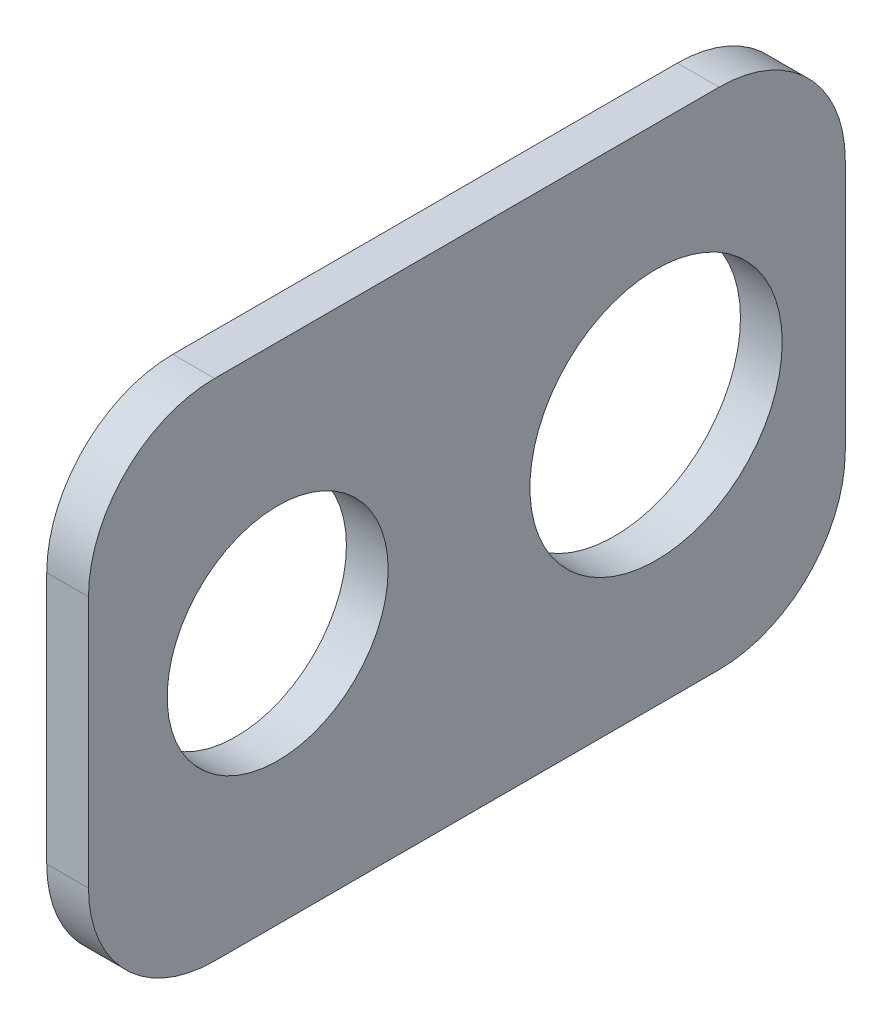
ISO-10303-21;
HEADER;
FILE_DESCRIPTION(('STEP AP214'),'2;1');
FILE_NAME('part.step','',(''),(''),'','','');
FILE_SCHEMA(('AUTOMOTIVE_DESIGN { 1 0 10303 214 1 1 1 1 }'));
ENDSEC;
DATA;
#1=APPLICATION_CONTEXT('core data for automotive mechanical design processes');
#2=APPLICATION_PROTOCOL_DEFINITION('international standard','automotive_design',2000,#1);
#3=PRODUCT_CONTEXT('',#1,'mechanical');
#4=PRODUCT('Part','Part','',(#3));
#5=PRODUCT_RELATED_PRODUCT_CATEGORY('part','',(#4));
#6=PRODUCT_DEFINITION_FORMATION('','',#4);
#7=PRODUCT_DEFINITION_CONTEXT('part definition',#1,'design');
#8=PRODUCT_DEFINITION('design','',#6,#7);
#9=PRODUCT_DEFINITION_SHAPE('','',#8);
#10=(LENGTH_UNIT() NAMED_UNIT(*) SI_UNIT(.MILLI.,.METRE.));
#11=(NAMED_UNIT(*) PLANE_ANGLE_UNIT() SI_UNIT($,.RADIAN.));
#12=(NAMED_UNIT(*) SI_UNIT($,.STERADIAN.) SOLID_ANGLE_UNIT());
#13=UNCERTAINTY_MEASURE_WITH_UNIT(LENGTH_MEASURE(1.E-05),#10,'distance_accuracy_value','');
#14=(GEOMETRIC_REPRESENTATION_CONTEXT(3) GLOBAL_UNCERTAINTY_ASSIGNED_CONTEXT((#13)) GLOBAL_UNIT_ASSIGNED_CONTEXT((#10,
#11,#12)) REPRESENTATION_CONTEXT('',''));
#15=CARTESIAN_POINT('',(0.,0.,0.));
#16=DIRECTION('',(0.,0.,1.));
#17=DIRECTION('',(1.,0.,0.));
#18=AXIS2_PLACEMENT_3D('',#15,#16,#17);
#19=CARTESIAN_POINT('',(4.20304803719862,0.,0.));
#20=DIRECTION('',(0.,0.,1.));
#21=DIRECTION('',(1.,0.,0.));
#22=AXIS2_PLACEMENT_3D('',#19,#20,#21);
#23=PLANE('',#22);
#24=DIRECTION('',(0.,1.,0.));
#25=VECTOR('',#24,1.);
#26=CARTESIAN_POINT('',(4.20304803719862,0.,0.));
#27=LINE('',#26,#25);
#28=CARTESIAN_POINT('',(4.20304803719862,12.7,0.));
#29=VERTEX_POINT('',#28);
#30=CARTESIAN_POINT('',(4.20304803719862,38.1,0.));
#31=VERTEX_POINT('',#30);
#32=EDGE_CURVE('E133',#29,#31,#27,.T.);
#33=ORIENTED_EDGE('',*,*,#32,.F.);
#34=DIRECTION('',(-1.,0.,0.));
#35=VECTOR('',#34,1.);
#36=CARTESIAN_POINT('',(0.,12.7,0.));
#37=LINE('',#36,#35);
#38=CARTESIAN_POINT('',(0.,12.7,0.));
#39=VERTEX_POINT('',#38);
#40=EDGE_CURVE('E119',#29,#39,#37,.T.);
#41=ORIENTED_EDGE('',*,*,#40,.T.);
#42=DIRECTION('',(0.,1.,0.));
#43=VECTOR('',#42,1.);
#44=CARTESIAN_POINT('',(0.,0.,0.));
#45=LINE('',#44,#43);
#46=CARTESIAN_POINT('',(0.,38.1,0.));
#47=VERTEX_POINT('',#46);
#48=EDGE_CURVE('E131',#39,#47,#45,.T.);
#49=ORIENTED_EDGE('',*,*,#48,.T.);
#50=DIRECTION('',(-1.,0.,0.));
#51=VECTOR('',#50,1.);
#52=CARTESIAN_POINT('',(4.20304803719862,38.1,0.));
#53=LINE('',#52,#51);
#54=EDGE_CURVE('E139',#47,#31,#53,.F.);
#55=ORIENTED_EDGE('',*,*,#54,.T.);
#56=EDGE_LOOP('',(#33,#41,#49,#55));
#57=FACE_BOUND('',#56,.T.);
#58=ADVANCED_FACE('F50',(#57),#23,.F.);
#59=CARTESIAN_POINT('',(4.20304803719862,50.8,0.));
#60=DIRECTION('',(0.,-1.,0.));
#61=DIRECTION('',(0.,0.,-1.));
#62=AXIS2_PLACEMENT_3D('',#59,#60,#61);
#63=PLANE('',#62);
#64=DIRECTION('',(0.,0.,1.));
#65=VECTOR('',#64,1.);
#66=CARTESIAN_POINT('',(4.20304803719862,50.8,0.));
#67=LINE('',#66,#65);
#68=CARTESIAN_POINT('',(4.20304803719862,50.8,12.7));
#69=VERTEX_POINT('',#68);
#70=CARTESIAN_POINT('',(4.20304803719862,50.8,63.5));
#71=VERTEX_POINT('',#70);
#72=EDGE_CURVE('E199',#69,#71,#67,.T.);
#73=ORIENTED_EDGE('',*,*,#72,.F.);
#74=DIRECTION('',(-1.,0.,0.));
#75=VECTOR('',#74,1.);
#76=CARTESIAN_POINT('',(4.20304803719862,50.8,12.7));
#77=LINE('',#76,#75);
#78=CARTESIAN_POINT('',(0.,50.8,12.7));
#79=VERTEX_POINT('',#78);
#80=EDGE_CURVE('E193',#69,#79,#77,.T.);
#81=ORIENTED_EDGE('',*,*,#80,.T.);
#82=DIRECTION('',(0.,0.,1.));
#83=VECTOR('',#82,1.);
#84=CARTESIAN_POINT('',(0.,50.8,0.));
#85=LINE('',#84,#83);
#86=CARTESIAN_POINT('',(0.,50.8,63.5));
#87=VERTEX_POINT('',#86);
#88=EDGE_CURVE('E142',#79,#87,#85,.T.);
#89=ORIENTED_EDGE('',*,*,#88,.T.);
#90=DIRECTION('',(-1.,0.,0.));
#91=VECTOR('',#90,1.);
#92=CARTESIAN_POINT('',(4.20304803719862,50.8,63.5));
#93=LINE('',#92,#91);
#94=EDGE_CURVE('E189',#87,#71,#93,.F.);
#95=ORIENTED_EDGE('',*,*,#94,.T.);
#96=EDGE_LOOP('',(#73,#81,#89,#95));
#97=FACE_BOUND('',#96,.T.);
#98=ADVANCED_FACE('F236',(#97),#63,.F.);
#99=CARTESIAN_POINT('',(4.20304803719862,0.,76.2));
#100=DIRECTION('',(0.,0.,1.));
#101=DIRECTION('',(1.,0.,0.));
#102=AXIS2_PLACEMENT_3D('',#99,#100,#101);
#103=PLANE('',#102);
#104=DIRECTION('',(0.,1.,0.));
#105=VECTOR('',#104,1.);
#106=CARTESIAN_POINT('',(4.20304803719862,0.,76.2));
#107=LINE('',#106,#105);
#108=CARTESIAN_POINT('',(4.20304803719862,12.7,76.2));
#109=VERTEX_POINT('',#108);
#110=CARTESIAN_POINT('',(4.20304803719862,38.1,76.2));
#111=VERTEX_POINT('',#110);
#112=EDGE_CURVE('E196',#109,#111,#107,.T.);
#113=ORIENTED_EDGE('',*,*,#112,.T.);
#114=DIRECTION('',(-1.,0.,0.));
#115=VECTOR('',#114,1.);
#116=CARTESIAN_POINT('',(0.,38.1,76.2));
#117=LINE('',#116,#115);
#118=CARTESIAN_POINT('',(0.,38.1,76.2));
#119=VERTEX_POINT('',#118);
#120=EDGE_CURVE('E11',#111,#119,#117,.T.);
#121=ORIENTED_EDGE('',*,*,#120,.T.);
#122=DIRECTION('',(0.,1.,0.));
#123=VECTOR('',#122,1.);
#124=CARTESIAN_POINT('',(0.,0.,76.2));
#125=LINE('',#124,#123);
#126=CARTESIAN_POINT('',(0.,12.7,76.2));
#127=VERTEX_POINT('',#126);
#128=EDGE_CURVE('E146',#127,#119,#125,.T.);
#129=ORIENTED_EDGE('',*,*,#128,.F.);
#130=DIRECTION('',(-1.,0.,0.));
#131=VECTOR('',#130,1.);
#132=CARTESIAN_POINT('',(4.20304803719862,12.7,76.2));
#133=LINE('',#132,#131);
#134=EDGE_CURVE('E57',#127,#109,#133,.F.);
#135=ORIENTED_EDGE('',*,*,#134,.T.);
#136=EDGE_LOOP('',(#113,#121,#129,#135));
#137=FACE_BOUND('',#136,.T.);
#138=ADVANCED_FACE('F233',(#137),#103,.T.);
#139=CARTESIAN_POINT('',(4.20304803719862,0.,0.));
#140=DIRECTION('',(0.,-1.,0.));
#141=DIRECTION('',(0.,0.,-1.));
#142=AXIS2_PLACEMENT_3D('',#139,#140,#141);
#143=PLANE('',#142);
#144=DIRECTION('',(0.,0.,1.));
#145=VECTOR('',#144,1.);
#146=CARTESIAN_POINT('',(0.,0.,0.));
#147=LINE('',#146,#145);
#148=CARTESIAN_POINT('',(0.,0.,12.7));
#149=VERTEX_POINT('',#148);
#150=CARTESIAN_POINT('',(0.,0.,63.5));
#151=VERTEX_POINT('',#150);
#152=EDGE_CURVE('E159',#149,#151,#147,.T.);
#153=ORIENTED_EDGE('',*,*,#152,.F.);
#154=DIRECTION('',(-1.,0.,0.));
#155=VECTOR('',#154,1.);
#156=CARTESIAN_POINT('',(4.20304803719862,0.,12.7));
#157=LINE('',#156,#155);
#158=CARTESIAN_POINT('',(4.20304803719862,0.,12.7));
#159=VERTEX_POINT('',#158);
#160=EDGE_CURVE('E118',#149,#159,#157,.F.);
#161=ORIENTED_EDGE('',*,*,#160,.T.);
#162=DIRECTION('',(0.,0.,1.));
#163=VECTOR('',#162,1.);
#164=CARTESIAN_POINT('',(4.20304803719862,0.,0.));
#165=LINE('',#164,#163);
#166=CARTESIAN_POINT('',(4.20304803719862,0.,63.5));
#167=VERTEX_POINT('',#166);
#168=EDGE_CURVE('E152',#159,#167,#165,.T.);
#169=ORIENTED_EDGE('',*,*,#168,.T.);
#170=DIRECTION('',(-1.,0.,0.));
#171=VECTOR('',#170,1.);
#172=CARTESIAN_POINT('',(4.20304803719862,0.,63.5));
#173=LINE('',#172,#171);
#174=EDGE_CURVE('E121',#167,#151,#173,.T.);
#175=ORIENTED_EDGE('',*,*,#174,.T.);
#176=EDGE_LOOP('',(#153,#161,#169,#175));
#177=FACE_BOUND('',#176,.T.);
#178=ADVANCED_FACE('F224',(#177),#143,.T.);
#179=CARTESIAN_POINT('',(4.20304803719862,0.,0.));
#180=DIRECTION('',(1.,0.,0.));
#181=DIRECTION('',(0.,0.,-1.));
#182=AXIS2_PLACEMENT_3D('',#179,#180,#181);
#183=PLANE('',#182);
#184=CARTESIAN_POINT('',(4.20304803719862,25.4,57.15));
#185=DIRECTION('',(1.,0.,0.));
#186=DIRECTION('',(0.,0.,-1.));
#187=AXIS2_PLACEMENT_3D('',#184,#185,#186);
#188=CIRCLE('',#187,11.1252);
#189=CARTESIAN_POINT('',(4.20304803719862,25.4,46.0248));
#190=VERTEX_POINT('',#189);
#191=EDGE_CURVE('E151',#190,#190,#188,.T.);
#192=ORIENTED_EDGE('',*,*,#191,.F.);
#193=EDGE_LOOP('',(#192));
#194=FACE_BOUND('',#193,.T.);
#195=CARTESIAN_POINT('',(4.20304803719862,25.4,19.05));
#196=DIRECTION('',(1.,0.,0.));
#197=DIRECTION('',(0.,0.,-1.));
#198=AXIS2_PLACEMENT_3D('',#195,#196,#197);
#199=CIRCLE('',#198,12.7);
#200=CARTESIAN_POINT('',(4.20304803719862,25.4,6.35));
#201=VERTEX_POINT('',#200);
#202=EDGE_CURVE('E209',#201,#201,#199,.T.);
#203=ORIENTED_EDGE('',*,*,#202,.F.);
#204=EDGE_LOOP('',(#203));
#205=FACE_BOUND('',#204,.T.);
#206=ORIENTED_EDGE('',*,*,#168,.F.);
#207=CARTESIAN_POINT('',(4.20304803719862,12.7,12.7));
#208=DIRECTION('',(1.,0.,0.));
#209=DIRECTION('',(0.,0.,-1.));
#210=AXIS2_PLACEMENT_3D('',#207,#208,#209);
#211=CIRCLE('',#210,12.7);
#212=EDGE_CURVE('E183',#159,#29,#211,.T.);
#213=ORIENTED_EDGE('',*,*,#212,.T.);
#214=ORIENTED_EDGE('',*,*,#32,.T.);
#215=CARTESIAN_POINT('',(4.20304803719862,38.1,12.7));
#216=DIRECTION('',(1.,0.,0.));
#217=DIRECTION('',(0.,0.,-1.));
#218=AXIS2_PLACEMENT_3D('',#215,#216,#217);
#219=CIRCLE('',#218,12.7);
#220=EDGE_CURVE('E185',#31,#69,#219,.T.);
#221=ORIENTED_EDGE('',*,*,#220,.T.);
#222=ORIENTED_EDGE('',*,*,#72,.T.);
#223=CARTESIAN_POINT('',(4.20304803719862,38.1,63.5));
#224=DIRECTION('',(1.,0.,0.));
#225=DIRECTION('',(0.,0.,-1.));
#226=AXIS2_PLACEMENT_3D('',#223,#224,#225);
#227=CIRCLE('',#226,12.7);
#228=EDGE_CURVE('E64',#71,#111,#227,.T.);
#229=ORIENTED_EDGE('',*,*,#228,.T.);
#230=ORIENTED_EDGE('',*,*,#112,.F.);
#231=CARTESIAN_POINT('',(4.20304803719862,12.7,63.5));
#232=DIRECTION('',(1.,0.,0.));
#233=DIRECTION('',(0.,0.,-1.));
#234=AXIS2_PLACEMENT_3D('',#231,#232,#233);
#235=CIRCLE('',#234,12.7);
#236=EDGE_CURVE('E179',#109,#167,#235,.T.);
#237=ORIENTED_EDGE('',*,*,#236,.T.);
#238=EDGE_LOOP('',(#206,#213,#214,#221,#222,#229,#230,#237));
#239=FACE_BOUND('',#238,.T.);
#240=ADVANCED_FACE('F219',(#194,#205,#239),#183,.T.);
#241=CARTESIAN_POINT('',(0.,0.,0.));
#242=DIRECTION('',(1.,0.,0.));
#243=DIRECTION('',(0.,0.,-1.));
#244=AXIS2_PLACEMENT_3D('',#241,#242,#243);
#245=PLANE('',#244);
#246=CARTESIAN_POINT('',(0.,25.4,57.15));
#247=DIRECTION('',(1.,0.,0.));
#248=DIRECTION('',(0.,0.,-1.));
#249=AXIS2_PLACEMENT_3D('',#246,#247,#248);
#250=CIRCLE('',#249,11.1252);
#251=CARTESIAN_POINT('',(0.,25.4,46.0248));
#252=VERTEX_POINT('',#251);
#253=EDGE_CURVE('E141',#252,#252,#250,.T.);
#254=ORIENTED_EDGE('',*,*,#253,.T.);
#255=EDGE_LOOP('',(#254));
#256=FACE_BOUND('',#255,.T.);
#257=CARTESIAN_POINT('',(0.,25.4,19.05));
#258=DIRECTION('',(1.,0.,0.));
#259=DIRECTION('',(0.,0.,-1.));
#260=AXIS2_PLACEMENT_3D('',#257,#258,#259);
#261=CIRCLE('',#260,12.7);
#262=CARTESIAN_POINT('',(0.,25.4,6.35));
#263=VERTEX_POINT('',#262);
#264=EDGE_CURVE('E206',#263,#263,#261,.T.);
#265=ORIENTED_EDGE('',*,*,#264,.T.);
#266=EDGE_LOOP('',(#265));
#267=FACE_BOUND('',#266,.T.);
#268=ORIENTED_EDGE('',*,*,#48,.F.);
#269=CARTESIAN_POINT('',(0.,12.7,12.7));
#270=DIRECTION('',(1.,0.,0.));
#271=DIRECTION('',(0.,0.,-1.));
#272=AXIS2_PLACEMENT_3D('',#269,#270,#271);
#273=CIRCLE('',#272,12.7);
#274=EDGE_CURVE('E111',#39,#149,#273,.F.);
#275=ORIENTED_EDGE('',*,*,#274,.T.);
#276=ORIENTED_EDGE('',*,*,#152,.T.);
#277=CARTESIAN_POINT('',(0.,12.7,63.5));
#278=DIRECTION('',(1.,0.,0.));
#279=DIRECTION('',(0.,0.,-1.));
#280=AXIS2_PLACEMENT_3D('',#277,#278,#279);
#281=CIRCLE('',#280,12.7);
#282=EDGE_CURVE('E138',#151,#127,#281,.F.);
#283=ORIENTED_EDGE('',*,*,#282,.T.);
#284=ORIENTED_EDGE('',*,*,#128,.T.);
#285=CARTESIAN_POINT('',(0.,38.1,63.5));
#286=DIRECTION('',(1.,0.,0.));
#287=DIRECTION('',(0.,0.,-1.));
#288=AXIS2_PLACEMENT_3D('',#285,#286,#287);
#289=CIRCLE('',#288,12.7);
#290=EDGE_CURVE('E170',#119,#87,#289,.F.);
#291=ORIENTED_EDGE('',*,*,#290,.T.);
#292=ORIENTED_EDGE('',*,*,#88,.F.);
#293=CARTESIAN_POINT('',(0.,38.1,12.7));
#294=DIRECTION('',(1.,0.,0.));
#295=DIRECTION('',(0.,0.,-1.));
#296=AXIS2_PLACEMENT_3D('',#293,#294,#295);
#297=CIRCLE('',#296,12.7);
#298=EDGE_CURVE('E127',#79,#47,#297,.F.);
#299=ORIENTED_EDGE('',*,*,#298,.T.);
#300=EDGE_LOOP('',(#268,#275,#276,#283,#284,#291,#292,#299));
#301=FACE_BOUND('',#300,.T.);
#302=ADVANCED_FACE('F140',(#256,#267,#301),#245,.F.);
#303=CARTESIAN_POINT('',(0.,25.4,19.05));
#304=DIRECTION('',(1.,0.,0.));
#305=DIRECTION('',(0.,0.,-1.));
#306=AXIS2_PLACEMENT_3D('',#303,#304,#305);
#307=CYLINDRICAL_SURFACE('',#306,12.7);
#308=ORIENTED_EDGE('',*,*,#264,.F.);
#309=EDGE_LOOP('',(#308));
#310=FACE_BOUND('',#309,.T.);
#311=ORIENTED_EDGE('',*,*,#202,.T.);
#312=EDGE_LOOP('',(#311));
#313=FACE_BOUND('',#312,.T.);
#314=ADVANCED_FACE('F265',(#310,#313),#307,.F.);
#315=CARTESIAN_POINT('',(0.,25.4,57.15));
#316=DIRECTION('',(1.,0.,0.));
#317=DIRECTION('',(0.,0.,-1.));
#318=AXIS2_PLACEMENT_3D('',#315,#316,#317);
#319=CYLINDRICAL_SURFACE('',#318,11.1252);
#320=ORIENTED_EDGE('',*,*,#253,.F.);
#321=EDGE_LOOP('',(#320));
#322=FACE_BOUND('',#321,.T.);
#323=ORIENTED_EDGE('',*,*,#191,.T.);
#324=EDGE_LOOP('',(#323));
#325=FACE_BOUND('',#324,.T.);
#326=ADVANCED_FACE('F217',(#322,#325),#319,.F.);
#327=CARTESIAN_POINT('',(4.20304803719862,12.7,12.7));
#328=DIRECTION('',(1.,0.,0.));
#329=DIRECTION('',(0.,0.,-1.));
#330=AXIS2_PLACEMENT_3D('',#327,#328,#329);
#331=CYLINDRICAL_SURFACE('',#330,12.7);
#332=ORIENTED_EDGE('',*,*,#212,.F.);
#333=ORIENTED_EDGE('',*,*,#160,.F.);
#334=ORIENTED_EDGE('',*,*,#274,.F.);
#335=ORIENTED_EDGE('',*,*,#40,.F.);
#336=EDGE_LOOP('',(#332,#333,#334,#335));
#337=FACE_BOUND('',#336,.T.);
#338=ADVANCED_FACE('F117',(#337),#331,.T.);
#339=CARTESIAN_POINT('',(4.20304803719862,38.1,12.7));
#340=DIRECTION('',(-1.,0.,0.));
#341=DIRECTION('',(0.,0.,1.));
#342=AXIS2_PLACEMENT_3D('',#339,#340,#341);
#343=CYLINDRICAL_SURFACE('',#342,12.7);
#344=ORIENTED_EDGE('',*,*,#220,.F.);
#345=ORIENTED_EDGE('',*,*,#54,.F.);
#346=ORIENTED_EDGE('',*,*,#298,.F.);
#347=ORIENTED_EDGE('',*,*,#80,.F.);
#348=EDGE_LOOP('',(#344,#345,#346,#347));
#349=FACE_BOUND('',#348,.T.);
#350=ADVANCED_FACE('F241',(#349),#343,.T.);
#351=CARTESIAN_POINT('',(4.20304803719862,38.1,63.5));
#352=DIRECTION('',(1.,0.,0.));
#353=DIRECTION('',(0.,0.,-1.));
#354=AXIS2_PLACEMENT_3D('',#351,#352,#353);
#355=CYLINDRICAL_SURFACE('',#354,12.7);
#356=ORIENTED_EDGE('',*,*,#228,.F.);
#357=ORIENTED_EDGE('',*,*,#94,.F.);
#358=ORIENTED_EDGE('',*,*,#290,.F.);
#359=ORIENTED_EDGE('',*,*,#120,.F.);
#360=EDGE_LOOP('',(#356,#357,#358,#359));
#361=FACE_BOUND('',#360,.T.);
#362=ADVANCED_FACE('F235',(#361),#355,.T.);
#363=CARTESIAN_POINT('',(4.20304803719862,12.7,63.5));
#364=DIRECTION('',(-1.,0.,0.));
#365=DIRECTION('',(0.,0.,1.));
#366=AXIS2_PLACEMENT_3D('',#363,#364,#365);
#367=CYLINDRICAL_SURFACE('',#366,12.7);
#368=ORIENTED_EDGE('',*,*,#236,.F.);
#369=ORIENTED_EDGE('',*,*,#134,.F.);
#370=ORIENTED_EDGE('',*,*,#282,.F.);
#371=ORIENTED_EDGE('',*,*,#174,.F.);
#372=EDGE_LOOP('',(#368,#369,#370,#371));
#373=FACE_BOUND('',#372,.T.);
#374=ADVANCED_FACE('F47',(#373),#367,.T.);
#375=CLOSED_SHELL('',(#58,#98,#138,#178,#240,#302,#314,#326,#338,#350,#362,#374));
#376=MANIFOLD_SOLID_BREP('B2',#375);
#377=ADVANCED_BREP_SHAPE_REPRESENTATION('',(#18,#376),#14);
#378=SHAPE_DEFINITION_REPRESENTATION(#9,#377);
ENDSEC;
END-ISO-10303-21;
